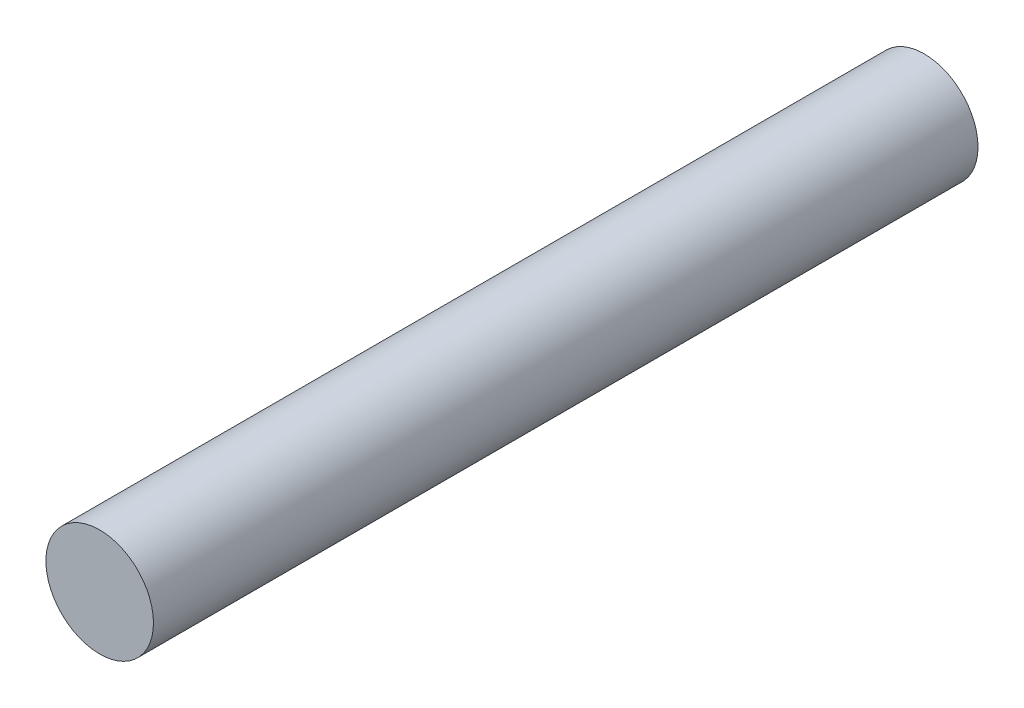
ISO-10303-21;
HEADER;
FILE_DESCRIPTION(('STEP AP214'),'2;1');
FILE_NAME('part.step','',(''),(''),'','','');
FILE_SCHEMA(('AUTOMOTIVE_DESIGN { 1 0 10303 214 1 1 1 1 }'));
ENDSEC;
DATA;
#1=APPLICATION_CONTEXT('core data for automotive mechanical design processes');
#2=APPLICATION_PROTOCOL_DEFINITION('international standard','automotive_design',2000,#1);
#3=PRODUCT_CONTEXT('',#1,'mechanical');
#4=PRODUCT('Part','Part','',(#3));
#5=PRODUCT_RELATED_PRODUCT_CATEGORY('part','',(#4));
#6=PRODUCT_DEFINITION_FORMATION('','',#4);
#7=PRODUCT_DEFINITION_CONTEXT('part definition',#1,'design');
#8=PRODUCT_DEFINITION('design','',#6,#7);
#9=PRODUCT_DEFINITION_SHAPE('','',#8);
#10=(LENGTH_UNIT() NAMED_UNIT(*) SI_UNIT(.MILLI.,.METRE.));
#11=(NAMED_UNIT(*) PLANE_ANGLE_UNIT() SI_UNIT($,.RADIAN.));
#12=(NAMED_UNIT(*) SI_UNIT($,.STERADIAN.) SOLID_ANGLE_UNIT());
#13=UNCERTAINTY_MEASURE_WITH_UNIT(LENGTH_MEASURE(1.E-05),#10,'distance_accuracy_value','');
#14=(GEOMETRIC_REPRESENTATION_CONTEXT(3) GLOBAL_UNCERTAINTY_ASSIGNED_CONTEXT((#13)) GLOBAL_UNIT_ASSIGNED_CONTEXT((#10,
#11,#12)) REPRESENTATION_CONTEXT('',''));
#15=CARTESIAN_POINT('',(0.,0.,0.));
#16=DIRECTION('',(0.,0.,1.));
#17=DIRECTION('',(1.,0.,0.));
#18=AXIS2_PLACEMENT_3D('',#15,#16,#17);
#19=CARTESIAN_POINT('',(0.,0.,46.));
#20=DIRECTION('',(0.,0.,-1.));
#21=DIRECTION('',(-1.,0.,0.));
#22=AXIS2_PLACEMENT_3D('',#19,#20,#21);
#23=CYLINDRICAL_SURFACE('',#22,3.);
#24=CARTESIAN_POINT('',(0.,0.,46.));
#25=DIRECTION('',(0.,0.,1.));
#26=DIRECTION('',(1.,0.,0.));
#27=AXIS2_PLACEMENT_3D('',#24,#25,#26);
#28=CIRCLE('',#27,3.);
#29=CARTESIAN_POINT('',(3.,0.,46.));
#30=VERTEX_POINT('',#29);
#31=EDGE_CURVE('E10',#30,#30,#28,.T.);
#32=ORIENTED_EDGE('',*,*,#31,.F.);
#33=EDGE_LOOP('',(#32));
#34=FACE_BOUND('',#33,.T.);
#35=CARTESIAN_POINT('',(0.,0.,0.));
#36=DIRECTION('',(0.,0.,1.));
#37=DIRECTION('',(1.,0.,0.));
#38=AXIS2_PLACEMENT_3D('',#35,#36,#37);
#39=CIRCLE('',#38,3.);
#40=CARTESIAN_POINT('',(3.,0.,0.));
#41=VERTEX_POINT('',#40);
#42=EDGE_CURVE('E40',#41,#41,#39,.T.);
#43=ORIENTED_EDGE('',*,*,#42,.T.);
#44=EDGE_LOOP('',(#43));
#45=FACE_BOUND('',#44,.T.);
#46=ADVANCED_FACE('F37',(#34,#45),#23,.T.);
#47=CARTESIAN_POINT('',(0.,0.,46.));
#48=DIRECTION('',(0.,0.,1.));
#49=DIRECTION('',(1.,0.,0.));
#50=AXIS2_PLACEMENT_3D('',#47,#48,#49);
#51=PLANE('',#50);
#52=ORIENTED_EDGE('',*,*,#31,.T.);
#53=EDGE_LOOP('',(#52));
#54=FACE_BOUND('',#53,.T.);
#55=ADVANCED_FACE('F54',(#54),#51,.T.);
#56=CARTESIAN_POINT('',(0.,0.,0.));
#57=DIRECTION('',(0.,0.,1.));
#58=DIRECTION('',(1.,0.,0.));
#59=AXIS2_PLACEMENT_3D('',#56,#57,#58);
#60=PLANE('',#59);
#61=ORIENTED_EDGE('',*,*,#42,.F.);
#62=EDGE_LOOP('',(#61));
#63=FACE_BOUND('',#62,.T.);
#64=ADVANCED_FACE('F52',(#63),#60,.F.);
#65=CLOSED_SHELL('',(#46,#55,#64));
#66=MANIFOLD_SOLID_BREP('B2',#65);
#67=ADVANCED_BREP_SHAPE_REPRESENTATION('',(#18,#66),#14);
#68=SHAPE_DEFINITION_REPRESENTATION(#9,#67);
ENDSEC;
END-ISO-10303-21;
